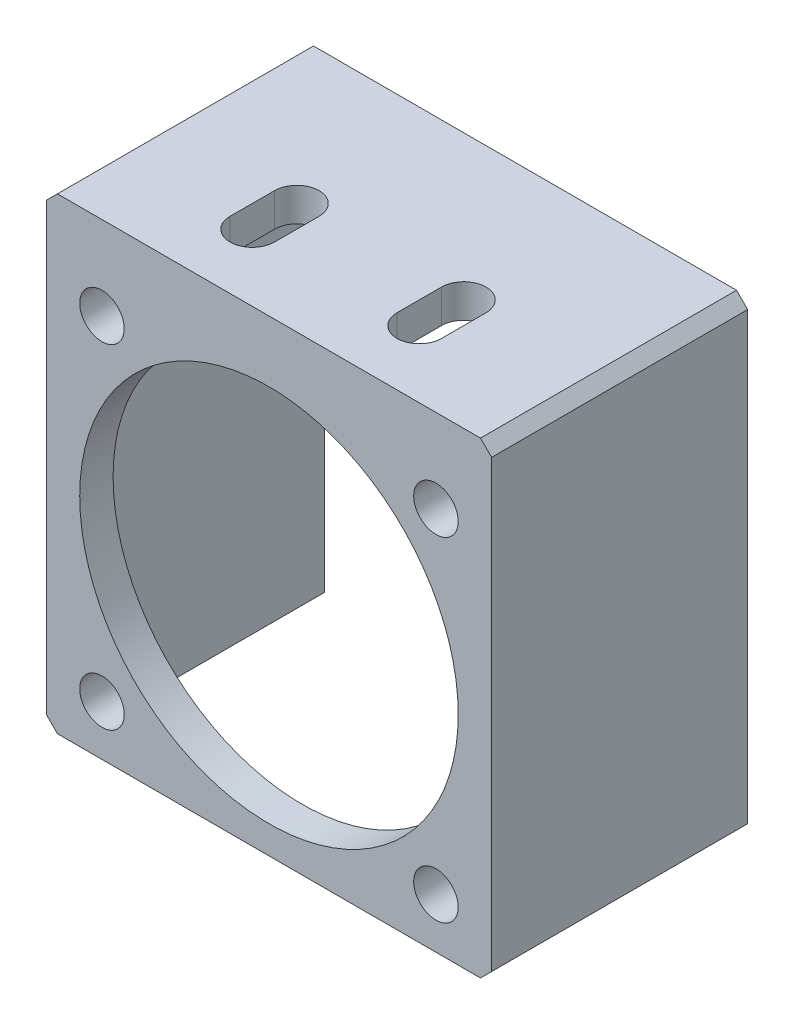
ISO-10303-21;
HEADER;
FILE_DESCRIPTION(('STEP AP214'),'2;1');
FILE_NAME('part.step','',(''),(''),'','','');
FILE_SCHEMA(('AUTOMOTIVE_DESIGN { 1 0 10303 214 1 1 1 1 }'));
ENDSEC;
DATA;
#1=APPLICATION_CONTEXT('core data for automotive mechanical design processes');
#2=APPLICATION_PROTOCOL_DEFINITION('international standard','automotive_design',2000,#1);
#3=PRODUCT_CONTEXT('',#1,'mechanical');
#4=PRODUCT('Part','Part','',(#3));
#5=PRODUCT_RELATED_PRODUCT_CATEGORY('part','',(#4));
#6=PRODUCT_DEFINITION_FORMATION('','',#4);
#7=PRODUCT_DEFINITION_CONTEXT('part definition',#1,'design');
#8=PRODUCT_DEFINITION('design','',#6,#7);
#9=PRODUCT_DEFINITION_SHAPE('','',#8);
#10=(LENGTH_UNIT() NAMED_UNIT(*) SI_UNIT(.MILLI.,.METRE.));
#11=(NAMED_UNIT(*) PLANE_ANGLE_UNIT() SI_UNIT($,.RADIAN.));
#12=(NAMED_UNIT(*) SI_UNIT($,.STERADIAN.) SOLID_ANGLE_UNIT());
#13=UNCERTAINTY_MEASURE_WITH_UNIT(LENGTH_MEASURE(1.E-05),#10,'distance_accuracy_value','');
#14=(GEOMETRIC_REPRESENTATION_CONTEXT(3) GLOBAL_UNCERTAINTY_ASSIGNED_CONTEXT((#13)) GLOBAL_UNIT_ASSIGNED_CONTEXT((#10,
#11,#12)) REPRESENTATION_CONTEXT('',''));
#15=CARTESIAN_POINT('',(0.,0.,0.));
#16=DIRECTION('',(0.,0.,1.));
#17=DIRECTION('',(1.,0.,0.));
#18=AXIS2_PLACEMENT_3D('',#15,#16,#17);
#19=CARTESIAN_POINT('',(-6.20338927881193,0.,3.));
#20=DIRECTION('',(1.,0.,0.));
#21=DIRECTION('',(0.,1.,0.));
#22=AXIS2_PLACEMENT_3D('',#19,#20,#21);
#23=PLANE('',#22);
#24=DIRECTION('',(0.,-1.,0.));
#25=VECTOR('',#24,1.);
#26=CARTESIAN_POINT('',(-6.20338927881193,42.3009142443808,-20.));
#27=LINE('',#26,#25);
#28=CARTESIAN_POINT('',(-6.20338927881193,41.3009142443808,-20.));
#29=VERTEX_POINT('',#28);
#30=CARTESIAN_POINT('',(-6.20338927881193,1.30091424438084,-20.));
#31=VERTEX_POINT('',#30);
#32=EDGE_CURVE('E277',#29,#31,#27,.T.);
#33=ORIENTED_EDGE('',*,*,#32,.F.);
#34=DIRECTION('',(0.,0.,1.));
#35=VECTOR('',#34,1.);
#36=CARTESIAN_POINT('',(-6.20338927881193,41.3009142443808,-22.));
#37=LINE('',#36,#35);
#38=CARTESIAN_POINT('',(-6.20338927881193,41.3009142443808,3.));
#39=VERTEX_POINT('',#38);
#40=EDGE_CURVE('E250',#29,#39,#37,.T.);
#41=ORIENTED_EDGE('',*,*,#40,.T.);
#42=DIRECTION('',(0.,-1.,0.));
#43=VECTOR('',#42,1.);
#44=CARTESIAN_POINT('',(-6.20338927881193,0.,3.));
#45=LINE('',#44,#43);
#46=CARTESIAN_POINT('',(-6.20338927881193,1.30091424438084,3.));
#47=VERTEX_POINT('',#46);
#48=EDGE_CURVE('E320',#39,#47,#45,.T.);
#49=ORIENTED_EDGE('',*,*,#48,.T.);
#50=DIRECTION('',(0.,0.,1.));
#51=VECTOR('',#50,1.);
#52=CARTESIAN_POINT('',(-6.20338927881193,1.30091424438084,-22.));
#53=LINE('',#52,#51);
#54=EDGE_CURVE('E257',#31,#47,#53,.T.);
#55=ORIENTED_EDGE('',*,*,#54,.F.);
#56=EDGE_LOOP('',(#33,#41,#49,#55));
#57=FACE_BOUND('',#56,.T.);
#58=ADVANCED_FACE('F43',(#57),#23,.T.);
#59=CARTESIAN_POINT('',(0.,42.3009142443808,3.));
#60=DIRECTION('',(0.,1.,0.));
#61=DIRECTION('',(0.,0.,1.));
#62=AXIS2_PLACEMENT_3D('',#59,#60,#61);
#63=PLANE('',#62);
#64=CARTESIAN_POINT('',(-18.7033892788119,42.3009142443808,-3.));
#65=DIRECTION('',(0.,1.,0.));
#66=DIRECTION('',(0.,0.,1.));
#67=AXIS2_PLACEMENT_3D('',#64,#65,#66);
#68=CIRCLE('',#67,2.);
#69=CARTESIAN_POINT('',(-20.7033892788119,42.3009142443808,-3.));
#70=VERTEX_POINT('',#69);
#71=CARTESIAN_POINT('',(-16.7033892788119,42.3009142443808,-3.));
#72=VERTEX_POINT('',#71);
#73=EDGE_CURVE('E58',#70,#72,#68,.T.);
#74=ORIENTED_EDGE('',*,*,#73,.F.);
#75=DIRECTION('',(0.,0.,1.));
#76=VECTOR('',#75,1.);
#77=CARTESIAN_POINT('',(-20.7033892788119,42.3009142443808,-7.));
#78=LINE('',#77,#76);
#79=CARTESIAN_POINT('',(-20.7033892788119,42.3009142443808,-7.));
#80=VERTEX_POINT('',#79);
#81=EDGE_CURVE('E204',#80,#70,#78,.T.);
#82=ORIENTED_EDGE('',*,*,#81,.F.);
#83=CARTESIAN_POINT('',(-18.7033892788119,42.3009142443808,-7.));
#84=DIRECTION('',(0.,1.,0.));
#85=DIRECTION('',(0.,0.,1.));
#86=AXIS2_PLACEMENT_3D('',#83,#84,#85);
#87=CIRCLE('',#86,2.);
#88=CARTESIAN_POINT('',(-16.7033892788119,42.3009142443808,-7.));
#89=VERTEX_POINT('',#88);
#90=EDGE_CURVE('E187',#89,#80,#87,.T.);
#91=ORIENTED_EDGE('',*,*,#90,.F.);
#92=DIRECTION('',(0.,0.,-1.));
#93=VECTOR('',#92,1.);
#94=CARTESIAN_POINT('',(-16.7033892788119,42.3009142443808,-3.));
#95=LINE('',#94,#93);
#96=EDGE_CURVE('E197',#72,#89,#95,.T.);
#97=ORIENTED_EDGE('',*,*,#96,.F.);
#98=EDGE_LOOP('',(#74,#82,#91,#97));
#99=FACE_BOUND('',#98,.T.);
#100=CARTESIAN_POINT('',(-33.7033892788119,42.3009142443808,-7.));
#101=DIRECTION('',(0.,1.,0.));
#102=DIRECTION('',(0.,0.,1.));
#103=AXIS2_PLACEMENT_3D('',#100,#101,#102);
#104=CIRCLE('',#103,2.);
#105=CARTESIAN_POINT('',(-31.7033892788119,42.3009142443808,-7.));
#106=VERTEX_POINT('',#105);
#107=CARTESIAN_POINT('',(-35.7033892788119,42.3009142443808,-7.));
#108=VERTEX_POINT('',#107);
#109=EDGE_CURVE('E66',#106,#108,#104,.T.);
#110=ORIENTED_EDGE('',*,*,#109,.F.);
#111=DIRECTION('',(0.,0.,-1.));
#112=VECTOR('',#111,1.);
#113=CARTESIAN_POINT('',(-31.7033892788119,42.3009142443808,-3.));
#114=LINE('',#113,#112);
#115=CARTESIAN_POINT('',(-31.7033892788119,42.3009142443808,-3.));
#116=VERTEX_POINT('',#115);
#117=EDGE_CURVE('E216',#116,#106,#114,.T.);
#118=ORIENTED_EDGE('',*,*,#117,.F.);
#119=CARTESIAN_POINT('',(-33.7033892788119,42.3009142443808,-3.));
#120=DIRECTION('',(0.,1.,0.));
#121=DIRECTION('',(0.,0.,1.));
#122=AXIS2_PLACEMENT_3D('',#119,#120,#121);
#123=CIRCLE('',#122,2.);
#124=CARTESIAN_POINT('',(-35.7033892788119,42.3009142443808,-3.));
#125=VERTEX_POINT('',#124);
#126=EDGE_CURVE('E225',#125,#116,#123,.T.);
#127=ORIENTED_EDGE('',*,*,#126,.F.);
#128=DIRECTION('',(0.,0.,1.));
#129=VECTOR('',#128,1.);
#130=CARTESIAN_POINT('',(-35.7033892788119,42.3009142443808,-7.));
#131=LINE('',#130,#129);
#132=EDGE_CURVE('E228',#108,#125,#131,.T.);
#133=ORIENTED_EDGE('',*,*,#132,.F.);
#134=EDGE_LOOP('',(#110,#118,#127,#133));
#135=FACE_BOUND('',#134,.T.);
#136=DIRECTION('',(1.,0.,0.));
#137=VECTOR('',#136,1.);
#138=CARTESIAN_POINT('',(0.,42.3009142443808,3.));
#139=LINE('',#138,#137);
#140=CARTESIAN_POINT('',(-45.2033892788119,42.3009142443808,3.));
#141=VERTEX_POINT('',#140);
#142=CARTESIAN_POINT('',(-7.20338927881193,42.3009142443808,3.));
#143=VERTEX_POINT('',#142);
#144=EDGE_CURVE('E323',#141,#143,#139,.T.);
#145=ORIENTED_EDGE('',*,*,#144,.T.);
#146=DIRECTION('',(0.,0.,1.));
#147=VECTOR('',#146,1.);
#148=CARTESIAN_POINT('',(-7.20338927881193,42.3009142443808,-22.));
#149=LINE('',#148,#147);
#150=CARTESIAN_POINT('',(-7.20338927881193,42.3009142443808,-20.));
#151=VERTEX_POINT('',#150);
#152=EDGE_CURVE('E244',#151,#143,#149,.T.);
#153=ORIENTED_EDGE('',*,*,#152,.F.);
#154=DIRECTION('',(1.,0.,0.));
#155=VECTOR('',#154,1.);
#156=CARTESIAN_POINT('',(-6.20338927881193,42.3009142443808,-20.));
#157=LINE('',#156,#155);
#158=CARTESIAN_POINT('',(-45.2033892788119,42.3009142443808,-20.));
#159=VERTEX_POINT('',#158);
#160=EDGE_CURVE('E274',#159,#151,#157,.T.);
#161=ORIENTED_EDGE('',*,*,#160,.F.);
#162=DIRECTION('',(0.,0.,1.));
#163=VECTOR('',#162,1.);
#164=CARTESIAN_POINT('',(-45.2033892788119,42.3009142443808,-22.));
#165=LINE('',#164,#163);
#166=EDGE_CURVE('E235',#159,#141,#165,.T.);
#167=ORIENTED_EDGE('',*,*,#166,.T.);
#168=EDGE_LOOP('',(#145,#153,#161,#167));
#169=FACE_BOUND('',#168,.T.);
#170=ADVANCED_FACE('F201',(#99,#135,#169),#63,.T.);
#171=CARTESIAN_POINT('',(0.,0.30091424438084,3.));
#172=DIRECTION('',(0.,1.,0.));
#173=DIRECTION('',(0.,0.,1.));
#174=AXIS2_PLACEMENT_3D('',#171,#172,#173);
#175=PLANE('',#174);
#176=DIRECTION('',(1.,0.,0.));
#177=VECTOR('',#176,1.);
#178=CARTESIAN_POINT('',(0.,0.30091424438084,3.));
#179=LINE('',#178,#177);
#180=CARTESIAN_POINT('',(-45.2033892788119,0.300914244380837,3.));
#181=VERTEX_POINT('',#180);
#182=CARTESIAN_POINT('',(-7.20338927881193,0.30091424438084,3.));
#183=VERTEX_POINT('',#182);
#184=EDGE_CURVE('E329',#181,#183,#179,.T.);
#185=ORIENTED_EDGE('',*,*,#184,.F.);
#186=DIRECTION('',(0.,0.,1.));
#187=VECTOR('',#186,1.);
#188=CARTESIAN_POINT('',(-45.2033892788119,0.300914244380837,-22.));
#189=LINE('',#188,#187);
#190=CARTESIAN_POINT('',(-45.2033892788119,0.300914244380837,-20.));
#191=VERTEX_POINT('',#190);
#192=EDGE_CURVE('E234',#191,#181,#189,.T.);
#193=ORIENTED_EDGE('',*,*,#192,.F.);
#194=DIRECTION('',(-1.,0.,0.));
#195=VECTOR('',#194,1.);
#196=CARTESIAN_POINT('',(-46.2033892788119,0.30091424438084,-20.));
#197=LINE('',#196,#195);
#198=CARTESIAN_POINT('',(-44.2033892788119,0.300914244380838,-20.));
#199=VERTEX_POINT('',#198);
#200=EDGE_CURVE('E268',#199,#191,#197,.T.);
#201=ORIENTED_EDGE('',*,*,#200,.F.);
#202=DIRECTION('',(0.,0.,1.));
#203=VECTOR('',#202,1.);
#204=CARTESIAN_POINT('',(-44.2033892788119,0.300914244380838,-20.));
#205=LINE('',#204,#203);
#206=CARTESIAN_POINT('',(-44.2033892788119,0.300914244380838,0.));
#207=VERTEX_POINT('',#206);
#208=EDGE_CURVE('E297',#199,#207,#205,.T.);
#209=ORIENTED_EDGE('',*,*,#208,.T.);
#210=DIRECTION('',(1.,0.,0.));
#211=VECTOR('',#210,1.);
#212=CARTESIAN_POINT('',(0.,0.30091424438084,0.));
#213=LINE('',#212,#211);
#214=CARTESIAN_POINT('',(-8.20338927881192,0.30091424438084,0.));
#215=VERTEX_POINT('',#214);
#216=EDGE_CURVE('E308',#207,#215,#213,.T.);
#217=ORIENTED_EDGE('',*,*,#216,.T.);
#218=DIRECTION('',(0.,0.,1.));
#219=VECTOR('',#218,1.);
#220=CARTESIAN_POINT('',(-8.20338927881192,0.30091424438084,-20.));
#221=LINE('',#220,#219);
#222=CARTESIAN_POINT('',(-8.20338927881192,0.30091424438084,-20.));
#223=VERTEX_POINT('',#222);
#224=EDGE_CURVE('E294',#223,#215,#221,.T.);
#225=ORIENTED_EDGE('',*,*,#224,.F.);
#226=DIRECTION('',(-1.,0.,0.));
#227=VECTOR('',#226,1.);
#228=CARTESIAN_POINT('',(-8.20338927881192,0.30091424438084,-20.));
#229=LINE('',#228,#227);
#230=CARTESIAN_POINT('',(-7.20338927881193,0.30091424438084,-20.));
#231=VERTEX_POINT('',#230);
#232=EDGE_CURVE('E280',#231,#223,#229,.T.);
#233=ORIENTED_EDGE('',*,*,#232,.F.);
#234=DIRECTION('',(0.,0.,1.));
#235=VECTOR('',#234,1.);
#236=CARTESIAN_POINT('',(-7.20338927881193,0.30091424438084,-22.));
#237=LINE('',#236,#235);
#238=EDGE_CURVE('E256',#231,#183,#237,.T.);
#239=ORIENTED_EDGE('',*,*,#238,.T.);
#240=EDGE_LOOP('',(#185,#193,#201,#209,#217,#225,#233,#239));
#241=FACE_BOUND('',#240,.T.);
#242=ADVANCED_FACE('F401',(#241),#175,.F.);
#243=CARTESIAN_POINT('',(0.,0.,3.));
#244=DIRECTION('',(0.,0.,1.));
#245=DIRECTION('',(1.,0.,0.));
#246=AXIS2_PLACEMENT_3D('',#243,#244,#245);
#247=PLANE('',#246);
#248=CARTESIAN_POINT('',(-26.2033892788119,19.8009142443808,3.));
#249=DIRECTION('',(0.,0.,1.));
#250=DIRECTION('',(1.,0.,0.));
#251=AXIS2_PLACEMENT_3D('',#248,#249,#250);
#252=CIRCLE('',#251,17.);
#253=CARTESIAN_POINT('',(-9.20338927881193,19.8009142443808,3.));
#254=VERTEX_POINT('',#253);
#255=EDGE_CURVE('E304',#254,#254,#252,.T.);
#256=ORIENTED_EDGE('',*,*,#255,.F.);
#257=EDGE_LOOP('',(#256));
#258=FACE_BOUND('',#257,.T.);
#259=CARTESIAN_POINT('',(-11.2033892788119,4.80091424438084,3.));
#260=DIRECTION('',(0.,0.,1.));
#261=DIRECTION('',(1.,0.,0.));
#262=AXIS2_PLACEMENT_3D('',#259,#260,#261);
#263=CIRCLE('',#262,2.);
#264=CARTESIAN_POINT('',(-9.20338927881193,4.80091424438084,3.));
#265=VERTEX_POINT('',#264);
#266=EDGE_CURVE('E307',#265,#265,#263,.T.);
#267=ORIENTED_EDGE('',*,*,#266,.F.);
#268=EDGE_LOOP('',(#267));
#269=FACE_BOUND('',#268,.T.);
#270=CARTESIAN_POINT('',(-41.2033892788119,4.80091424438084,3.));
#271=DIRECTION('',(0.,0.,1.));
#272=DIRECTION('',(1.,0.,0.));
#273=AXIS2_PLACEMENT_3D('',#270,#271,#272);
#274=CIRCLE('',#273,2.);
#275=CARTESIAN_POINT('',(-39.2033892788119,4.80091424438084,3.));
#276=VERTEX_POINT('',#275);
#277=EDGE_CURVE('E311',#276,#276,#274,.T.);
#278=ORIENTED_EDGE('',*,*,#277,.F.);
#279=EDGE_LOOP('',(#278));
#280=FACE_BOUND('',#279,.T.);
#281=CARTESIAN_POINT('',(-11.2033892788119,34.8009142443808,3.));
#282=DIRECTION('',(0.,0.,1.));
#283=DIRECTION('',(1.,0.,0.));
#284=AXIS2_PLACEMENT_3D('',#281,#282,#283);
#285=CIRCLE('',#284,2.);
#286=CARTESIAN_POINT('',(-9.20338927881193,34.8009142443808,3.));
#287=VERTEX_POINT('',#286);
#288=EDGE_CURVE('E314',#287,#287,#285,.T.);
#289=ORIENTED_EDGE('',*,*,#288,.F.);
#290=EDGE_LOOP('',(#289));
#291=FACE_BOUND('',#290,.T.);
#292=CARTESIAN_POINT('',(-41.2033892788119,34.8009142443808,3.));
#293=DIRECTION('',(0.,0.,1.));
#294=DIRECTION('',(1.,0.,0.));
#295=AXIS2_PLACEMENT_3D('',#292,#293,#294);
#296=CIRCLE('',#295,2.);
#297=CARTESIAN_POINT('',(-39.2033892788119,34.8009142443808,3.));
#298=VERTEX_POINT('',#297);
#299=EDGE_CURVE('E317',#298,#298,#296,.T.);
#300=ORIENTED_EDGE('',*,*,#299,.F.);
#301=EDGE_LOOP('',(#300));
#302=FACE_BOUND('',#301,.T.);
#303=ORIENTED_EDGE('',*,*,#48,.F.);
#304=DIRECTION('',(-0.707106781186547,0.707106781186548,0.));
#305=VECTOR('',#304,1.);
#306=CARTESIAN_POINT('',(17.5487624827845,17.5487624827844,3.));
#307=LINE('',#306,#305);
#308=EDGE_CURVE('E211',#39,#143,#307,.T.);
#309=ORIENTED_EDGE('',*,*,#308,.T.);
#310=ORIENTED_EDGE('',*,*,#144,.F.);
#311=DIRECTION('',(0.707106781186548,0.707106781186548,0.));
#312=VECTOR('',#311,1.);
#313=CARTESIAN_POINT('',(-43.7521517615964,43.7521517615964,3.));
#314=LINE('',#313,#312);
#315=CARTESIAN_POINT('',(-46.2033892788119,41.3009142443808,3.));
#316=VERTEX_POINT('',#315);
#317=EDGE_CURVE('E241',#316,#141,#314,.T.);
#318=ORIENTED_EDGE('',*,*,#317,.F.);
#319=DIRECTION('',(0.,-1.,0.));
#320=VECTOR('',#319,1.);
#321=CARTESIAN_POINT('',(-46.2033892788119,0.,3.));
#322=LINE('',#321,#320);
#323=CARTESIAN_POINT('',(-46.2033892788119,1.30091424438084,3.));
#324=VERTEX_POINT('',#323);
#325=EDGE_CURVE('E326',#316,#324,#322,.T.);
#326=ORIENTED_EDGE('',*,*,#325,.T.);
#327=DIRECTION('',(-0.707106781186548,0.707106781186547,0.));
#328=VECTOR('',#327,1.);
#329=CARTESIAN_POINT('',(-22.4512375172155,-22.4512375172155,3.));
#330=LINE('',#329,#328);
#331=EDGE_CURVE('E232',#181,#324,#330,.T.);
#332=ORIENTED_EDGE('',*,*,#331,.F.);
#333=ORIENTED_EDGE('',*,*,#184,.T.);
#334=DIRECTION('',(0.707106781186546,0.707106781186549,0.));
#335=VECTOR('',#334,1.);
#336=CARTESIAN_POINT('',(-3.7521517615964,3.75215176159638,3.));
#337=LINE('',#336,#335);
#338=EDGE_CURVE('E239',#183,#47,#337,.T.);
#339=ORIENTED_EDGE('',*,*,#338,.T.);
#340=EDGE_LOOP('',(#303,#309,#310,#318,#326,#332,#333,#339));
#341=FACE_BOUND('',#340,.T.);
#342=ADVANCED_FACE('F455',(#258,#269,#280,#291,#302,#341),#247,.T.);
#343=CARTESIAN_POINT('',(0.,0.,-20.));
#344=DIRECTION('',(0.,0.,-1.));
#345=DIRECTION('',(-1.,0.,0.));
#346=AXIS2_PLACEMENT_3D('',#343,#344,#345);
#347=PLANE('',#346);
#348=ORIENTED_EDGE('',*,*,#160,.T.);
#349=DIRECTION('',(0.707106781186547,-0.707106781186548,0.));
#350=VECTOR('',#349,1.);
#351=CARTESIAN_POINT('',(17.5487624827845,17.5487624827844,-20.));
#352=LINE('',#351,#350);
#353=EDGE_CURVE('E355',#151,#29,#352,.T.);
#354=ORIENTED_EDGE('',*,*,#353,.T.);
#355=ORIENTED_EDGE('',*,*,#32,.T.);
#356=DIRECTION('',(-0.707106781186546,-0.707106781186549,0.));
#357=VECTOR('',#356,1.);
#358=CARTESIAN_POINT('',(-3.7521517615964,3.75215176159638,-20.));
#359=LINE('',#358,#357);
#360=EDGE_CURVE('E332',#31,#231,#359,.T.);
#361=ORIENTED_EDGE('',*,*,#360,.T.);
#362=ORIENTED_EDGE('',*,*,#232,.T.);
#363=DIRECTION('',(0.,1.,0.));
#364=VECTOR('',#363,1.);
#365=CARTESIAN_POINT('',(-8.20338927881192,39.3009142443808,-20.));
#366=LINE('',#365,#364);
#367=CARTESIAN_POINT('',(-8.20338927881192,39.3009142443808,-20.));
#368=VERTEX_POINT('',#367);
#369=EDGE_CURVE('E282',#223,#368,#366,.T.);
#370=ORIENTED_EDGE('',*,*,#369,.T.);
#371=DIRECTION('',(-1.,0.,0.));
#372=VECTOR('',#371,1.);
#373=CARTESIAN_POINT('',(-44.2033892788119,39.3009142443808,-20.));
#374=LINE('',#373,#372);
#375=CARTESIAN_POINT('',(-44.2033892788119,39.3009142443808,-20.));
#376=VERTEX_POINT('',#375);
#377=EDGE_CURVE('E262',#368,#376,#374,.T.);
#378=ORIENTED_EDGE('',*,*,#377,.T.);
#379=DIRECTION('',(0.,-1.,0.));
#380=VECTOR('',#379,1.);
#381=CARTESIAN_POINT('',(-44.2033892788119,0.300914244380838,-20.));
#382=LINE('',#381,#380);
#383=EDGE_CURVE('E265',#376,#199,#382,.T.);
#384=ORIENTED_EDGE('',*,*,#383,.T.);
#385=ORIENTED_EDGE('',*,*,#200,.T.);
#386=DIRECTION('',(0.707106781186548,-0.707106781186547,0.));
#387=VECTOR('',#386,1.);
#388=CARTESIAN_POINT('',(-22.4512375172155,-22.4512375172155,-20.));
#389=LINE('',#388,#387);
#390=CARTESIAN_POINT('',(-46.2033892788119,1.30091424438084,-20.));
#391=VERTEX_POINT('',#390);
#392=EDGE_CURVE('E351',#391,#191,#389,.T.);
#393=ORIENTED_EDGE('',*,*,#392,.F.);
#394=DIRECTION('',(0.,1.,0.));
#395=VECTOR('',#394,1.);
#396=CARTESIAN_POINT('',(-46.2033892788119,42.3009142443808,-20.));
#397=LINE('',#396,#395);
#398=CARTESIAN_POINT('',(-46.2033892788119,41.3009142443808,-20.));
#399=VERTEX_POINT('',#398);
#400=EDGE_CURVE('E271',#391,#399,#397,.T.);
#401=ORIENTED_EDGE('',*,*,#400,.T.);
#402=DIRECTION('',(-0.707106781186548,-0.707106781186548,0.));
#403=VECTOR('',#402,1.);
#404=CARTESIAN_POINT('',(-43.7521517615964,43.7521517615964,-20.));
#405=LINE('',#404,#403);
#406=EDGE_CURVE('E353',#159,#399,#405,.T.);
#407=ORIENTED_EDGE('',*,*,#406,.F.);
#408=EDGE_LOOP('',(#348,#354,#355,#361,#362,#370,#378,#384,#385,#393,#401,#407));
#409=FACE_BOUND('',#408,.T.);
#410=ADVANCED_FACE('F432',(#409),#347,.T.);
#411=CARTESIAN_POINT('',(0.,0.,0.));
#412=DIRECTION('',(0.,0.,1.));
#413=DIRECTION('',(1.,0.,0.));
#414=AXIS2_PLACEMENT_3D('',#411,#412,#413);
#415=PLANE('',#414);
#416=CARTESIAN_POINT('',(-41.2033892788119,34.8009142443808,0.));
#417=DIRECTION('',(0.,0.,1.));
#418=DIRECTION('',(1.,0.,0.));
#419=AXIS2_PLACEMENT_3D('',#416,#417,#418);
#420=CIRCLE('',#419,2.);
#421=CARTESIAN_POINT('',(-39.2033892788119,34.8009142443808,0.));
#422=VERTEX_POINT('',#421);
#423=EDGE_CURVE('E344',#422,#422,#420,.T.);
#424=ORIENTED_EDGE('',*,*,#423,.T.);
#425=EDGE_LOOP('',(#424));
#426=FACE_BOUND('',#425,.T.);
#427=CARTESIAN_POINT('',(-11.2033892788119,34.8009142443808,0.));
#428=DIRECTION('',(0.,0.,1.));
#429=DIRECTION('',(1.,0.,0.));
#430=AXIS2_PLACEMENT_3D('',#427,#428,#429);
#431=CIRCLE('',#430,2.);
#432=CARTESIAN_POINT('',(-9.20338927881193,34.8009142443808,0.));
#433=VERTEX_POINT('',#432);
#434=EDGE_CURVE('E341',#433,#433,#431,.T.);
#435=ORIENTED_EDGE('',*,*,#434,.T.);
#436=EDGE_LOOP('',(#435));
#437=FACE_BOUND('',#436,.T.);
#438=CARTESIAN_POINT('',(-41.2033892788119,4.80091424438084,0.));
#439=DIRECTION('',(0.,0.,1.));
#440=DIRECTION('',(1.,0.,0.));
#441=AXIS2_PLACEMENT_3D('',#438,#439,#440);
#442=CIRCLE('',#441,2.);
#443=CARTESIAN_POINT('',(-39.2033892788119,4.80091424438084,0.));
#444=VERTEX_POINT('',#443);
#445=EDGE_CURVE('E338',#444,#444,#442,.T.);
#446=ORIENTED_EDGE('',*,*,#445,.T.);
#447=EDGE_LOOP('',(#446));
#448=FACE_BOUND('',#447,.T.);
#449=CARTESIAN_POINT('',(-11.2033892788119,4.80091424438084,0.));
#450=DIRECTION('',(0.,0.,1.));
#451=DIRECTION('',(1.,0.,0.));
#452=AXIS2_PLACEMENT_3D('',#449,#450,#451);
#453=CIRCLE('',#452,2.);
#454=CARTESIAN_POINT('',(-9.20338927881193,4.80091424438084,0.));
#455=VERTEX_POINT('',#454);
#456=EDGE_CURVE('E335',#455,#455,#453,.T.);
#457=ORIENTED_EDGE('',*,*,#456,.T.);
#458=EDGE_LOOP('',(#457));
#459=FACE_BOUND('',#458,.T.);
#460=CARTESIAN_POINT('',(-26.2033892788119,19.8009142443808,0.));
#461=DIRECTION('',(0.,0.,1.));
#462=DIRECTION('',(1.,0.,0.));
#463=AXIS2_PLACEMENT_3D('',#460,#461,#462);
#464=CIRCLE('',#463,17.);
#465=CARTESIAN_POINT('',(-9.20338927881193,19.8009142443808,0.));
#466=VERTEX_POINT('',#465);
#467=EDGE_CURVE('E303',#466,#466,#464,.T.);
#468=ORIENTED_EDGE('',*,*,#467,.T.);
#469=EDGE_LOOP('',(#468));
#470=FACE_BOUND('',#469,.T.);
#471=DIRECTION('',(0.,1.,0.));
#472=VECTOR('',#471,1.);
#473=CARTESIAN_POINT('',(-8.20338927881192,39.3009142443808,0.));
#474=LINE('',#473,#472);
#475=CARTESIAN_POINT('',(-8.20338927881192,39.3009142443808,0.));
#476=VERTEX_POINT('',#475);
#477=EDGE_CURVE('E266',#215,#476,#474,.T.);
#478=ORIENTED_EDGE('',*,*,#477,.F.);
#479=ORIENTED_EDGE('',*,*,#216,.F.);
#480=DIRECTION('',(0.,-1.,0.));
#481=VECTOR('',#480,1.);
#482=CARTESIAN_POINT('',(-44.2033892788119,0.300914244380838,0.));
#483=LINE('',#482,#481);
#484=CARTESIAN_POINT('',(-44.2033892788119,39.3009142443808,0.));
#485=VERTEX_POINT('',#484);
#486=EDGE_CURVE('E287',#485,#207,#483,.T.);
#487=ORIENTED_EDGE('',*,*,#486,.F.);
#488=DIRECTION('',(-1.,0.,0.));
#489=VECTOR('',#488,1.);
#490=CARTESIAN_POINT('',(-44.2033892788119,39.3009142443808,0.));
#491=LINE('',#490,#489);
#492=EDGE_CURVE('E259',#476,#485,#491,.T.);
#493=ORIENTED_EDGE('',*,*,#492,.F.);
#494=EDGE_LOOP('',(#478,#479,#487,#493));
#495=FACE_BOUND('',#494,.T.);
#496=ADVANCED_FACE('F429',(#426,#437,#448,#459,#470,#495),#415,.F.);
#497=CARTESIAN_POINT('',(-46.2033892788119,0.,3.));
#498=DIRECTION('',(1.,0.,0.));
#499=DIRECTION('',(0.,0.,-1.));
#500=AXIS2_PLACEMENT_3D('',#497,#498,#499);
#501=PLANE('',#500);
#502=ORIENTED_EDGE('',*,*,#325,.F.);
#503=DIRECTION('',(0.,0.,1.));
#504=VECTOR('',#503,1.);
#505=CARTESIAN_POINT('',(-46.2033892788119,41.3009142443808,-22.));
#506=LINE('',#505,#504);
#507=EDGE_CURVE('E243',#399,#316,#506,.T.);
#508=ORIENTED_EDGE('',*,*,#507,.F.);
#509=ORIENTED_EDGE('',*,*,#400,.F.);
#510=DIRECTION('',(0.,0.,1.));
#511=VECTOR('',#510,1.);
#512=CARTESIAN_POINT('',(-46.2033892788119,1.30091424438084,-22.));
#513=LINE('',#512,#511);
#514=EDGE_CURVE('E236',#391,#324,#513,.T.);
#515=ORIENTED_EDGE('',*,*,#514,.T.);
#516=EDGE_LOOP('',(#502,#508,#509,#515));
#517=FACE_BOUND('',#516,.T.);
#518=ADVANCED_FACE('F410',(#517),#501,.F.);
#519=CARTESIAN_POINT('',(-41.2033892788119,34.8009142443808,3.));
#520=DIRECTION('',(0.,0.,-1.));
#521=DIRECTION('',(-1.,0.,0.));
#522=AXIS2_PLACEMENT_3D('',#519,#520,#521);
#523=CYLINDRICAL_SURFACE('',#522,2.);
#524=ORIENTED_EDGE('',*,*,#299,.T.);
#525=EDGE_LOOP('',(#524));
#526=FACE_BOUND('',#525,.T.);
#527=ORIENTED_EDGE('',*,*,#423,.F.);
#528=EDGE_LOOP('',(#527));
#529=FACE_BOUND('',#528,.T.);
#530=ADVANCED_FACE('F406',(#526,#529),#523,.F.);
#531=CARTESIAN_POINT('',(-11.2033892788119,34.8009142443808,3.));
#532=DIRECTION('',(0.,0.,-1.));
#533=DIRECTION('',(-1.,0.,0.));
#534=AXIS2_PLACEMENT_3D('',#531,#532,#533);
#535=CYLINDRICAL_SURFACE('',#534,2.);
#536=ORIENTED_EDGE('',*,*,#288,.T.);
#537=EDGE_LOOP('',(#536));
#538=FACE_BOUND('',#537,.T.);
#539=ORIENTED_EDGE('',*,*,#434,.F.);
#540=EDGE_LOOP('',(#539));
#541=FACE_BOUND('',#540,.T.);
#542=ADVANCED_FACE('F409',(#538,#541),#535,.F.);
#543=CARTESIAN_POINT('',(-41.2033892788119,4.80091424438084,3.));
#544=DIRECTION('',(0.,0.,-1.));
#545=DIRECTION('',(-1.,0.,0.));
#546=AXIS2_PLACEMENT_3D('',#543,#544,#545);
#547=CYLINDRICAL_SURFACE('',#546,2.);
#548=ORIENTED_EDGE('',*,*,#277,.T.);
#549=EDGE_LOOP('',(#548));
#550=FACE_BOUND('',#549,.T.);
#551=ORIENTED_EDGE('',*,*,#445,.F.);
#552=EDGE_LOOP('',(#551));
#553=FACE_BOUND('',#552,.T.);
#554=ADVANCED_FACE('F414',(#550,#553),#547,.F.);
#555=CARTESIAN_POINT('',(-11.2033892788119,4.80091424438084,3.));
#556=DIRECTION('',(0.,0.,-1.));
#557=DIRECTION('',(-1.,0.,0.));
#558=AXIS2_PLACEMENT_3D('',#555,#556,#557);
#559=CYLINDRICAL_SURFACE('',#558,2.);
#560=ORIENTED_EDGE('',*,*,#266,.T.);
#561=EDGE_LOOP('',(#560));
#562=FACE_BOUND('',#561,.T.);
#563=ORIENTED_EDGE('',*,*,#456,.F.);
#564=EDGE_LOOP('',(#563));
#565=FACE_BOUND('',#564,.T.);
#566=ADVANCED_FACE('F417',(#562,#565),#559,.F.);
#567=CARTESIAN_POINT('',(-26.2033892788119,19.8009142443808,3.));
#568=DIRECTION('',(0.,0.,-1.));
#569=DIRECTION('',(-1.,0.,0.));
#570=AXIS2_PLACEMENT_3D('',#567,#568,#569);
#571=CYLINDRICAL_SURFACE('',#570,17.);
#572=ORIENTED_EDGE('',*,*,#255,.T.);
#573=EDGE_LOOP('',(#572));
#574=FACE_BOUND('',#573,.T.);
#575=ORIENTED_EDGE('',*,*,#467,.F.);
#576=EDGE_LOOP('',(#575));
#577=FACE_BOUND('',#576,.T.);
#578=ADVANCED_FACE('F45',(#574,#577),#571,.F.);
#579=CARTESIAN_POINT('',(-44.2033892788119,39.3009142443808,-20.));
#580=DIRECTION('',(0.,1.,0.));
#581=DIRECTION('',(-1.,0.,0.));
#582=AXIS2_PLACEMENT_3D('',#579,#580,#581);
#583=PLANE('',#582);
#584=DIRECTION('',(0.,0.,1.));
#585=VECTOR('',#584,1.);
#586=CARTESIAN_POINT('',(-20.7033892788119,39.3009142443808,-20.));
#587=LINE('',#586,#585);
#588=CARTESIAN_POINT('',(-20.7033892788119,39.3009142443808,-7.));
#589=VERTEX_POINT('',#588);
#590=CARTESIAN_POINT('',(-20.7033892788119,39.3009142443808,-3.));
#591=VERTEX_POINT('',#590);
#592=EDGE_CURVE('E51',#589,#591,#587,.T.);
#593=ORIENTED_EDGE('',*,*,#592,.T.);
#594=CARTESIAN_POINT('',(-18.7033892788119,39.3009142443808,-3.));
#595=DIRECTION('',(0.,1.,0.));
#596=DIRECTION('',(-1.,0.,0.));
#597=AXIS2_PLACEMENT_3D('',#594,#595,#596);
#598=CIRCLE('',#597,2.);
#599=CARTESIAN_POINT('',(-16.7033892788119,39.3009142443808,-3.));
#600=VERTEX_POINT('',#599);
#601=EDGE_CURVE('E11',#591,#600,#598,.T.);
#602=ORIENTED_EDGE('',*,*,#601,.T.);
#603=DIRECTION('',(0.,0.,-1.));
#604=VECTOR('',#603,1.);
#605=CARTESIAN_POINT('',(-16.7033892788119,39.3009142443808,-20.));
#606=LINE('',#605,#604);
#607=CARTESIAN_POINT('',(-16.7033892788119,39.3009142443808,-7.));
#608=VERTEX_POINT('',#607);
#609=EDGE_CURVE('E370',#600,#608,#606,.T.);
#610=ORIENTED_EDGE('',*,*,#609,.T.);
#611=CARTESIAN_POINT('',(-18.7033892788119,39.3009142443808,-7.));
#612=DIRECTION('',(0.,1.,0.));
#613=DIRECTION('',(-1.,0.,0.));
#614=AXIS2_PLACEMENT_3D('',#611,#612,#613);
#615=CIRCLE('',#614,2.);
#616=EDGE_CURVE('E190',#608,#589,#615,.T.);
#617=ORIENTED_EDGE('',*,*,#616,.T.);
#618=EDGE_LOOP('',(#593,#602,#610,#617));
#619=FACE_BOUND('',#618,.T.);
#620=DIRECTION('',(0.,0.,-1.));
#621=VECTOR('',#620,1.);
#622=CARTESIAN_POINT('',(-31.7033892788119,39.3009142443808,-20.));
#623=LINE('',#622,#621);
#624=CARTESIAN_POINT('',(-31.7033892788119,39.3009142443808,-3.));
#625=VERTEX_POINT('',#624);
#626=CARTESIAN_POINT('',(-31.7033892788119,39.3009142443808,-7.));
#627=VERTEX_POINT('',#626);
#628=EDGE_CURVE('E364',#625,#627,#623,.T.);
#629=ORIENTED_EDGE('',*,*,#628,.T.);
#630=CARTESIAN_POINT('',(-33.7033892788119,39.3009142443808,-7.));
#631=DIRECTION('',(0.,1.,0.));
#632=DIRECTION('',(-1.,0.,0.));
#633=AXIS2_PLACEMENT_3D('',#630,#631,#632);
#634=CIRCLE('',#633,2.);
#635=CARTESIAN_POINT('',(-35.7033892788119,39.3009142443808,-7.));
#636=VERTEX_POINT('',#635);
#637=EDGE_CURVE('E367',#627,#636,#634,.T.);
#638=ORIENTED_EDGE('',*,*,#637,.T.);
#639=DIRECTION('',(0.,0.,1.));
#640=VECTOR('',#639,1.);
#641=CARTESIAN_POINT('',(-35.7033892788119,39.3009142443808,-20.));
#642=LINE('',#641,#640);
#643=CARTESIAN_POINT('',(-35.7033892788119,39.3009142443808,-3.));
#644=VERTEX_POINT('',#643);
#645=EDGE_CURVE('E358',#636,#644,#642,.T.);
#646=ORIENTED_EDGE('',*,*,#645,.T.);
#647=CARTESIAN_POINT('',(-33.7033892788119,39.3009142443808,-3.));
#648=DIRECTION('',(0.,1.,0.));
#649=DIRECTION('',(-1.,0.,0.));
#650=AXIS2_PLACEMENT_3D('',#647,#648,#649);
#651=CIRCLE('',#650,2.);
#652=EDGE_CURVE('E361',#644,#625,#651,.T.);
#653=ORIENTED_EDGE('',*,*,#652,.T.);
#654=EDGE_LOOP('',(#629,#638,#646,#653));
#655=FACE_BOUND('',#654,.T.);
#656=ORIENTED_EDGE('',*,*,#492,.T.);
#657=DIRECTION('',(0.,0.,1.));
#658=VECTOR('',#657,1.);
#659=CARTESIAN_POINT('',(-44.2033892788119,39.3009142443808,-20.));
#660=LINE('',#659,#658);
#661=EDGE_CURVE('E300',#376,#485,#660,.T.);
#662=ORIENTED_EDGE('',*,*,#661,.F.);
#663=ORIENTED_EDGE('',*,*,#377,.F.);
#664=DIRECTION('',(0.,0.,1.));
#665=VECTOR('',#664,1.);
#666=CARTESIAN_POINT('',(-8.20338927881192,39.3009142443808,-20.));
#667=LINE('',#666,#665);
#668=EDGE_CURVE('E284',#368,#476,#667,.T.);
#669=ORIENTED_EDGE('',*,*,#668,.T.);
#670=EDGE_LOOP('',(#656,#662,#663,#669));
#671=FACE_BOUND('',#670,.T.);
#672=ADVANCED_FACE('F374',(#619,#655,#671),#583,.F.);
#673=CARTESIAN_POINT('',(-44.2033892788119,0.300914244380838,-20.));
#674=DIRECTION('',(-1.,0.,0.));
#675=DIRECTION('',(0.,0.,1.));
#676=AXIS2_PLACEMENT_3D('',#673,#674,#675);
#677=PLANE('',#676);
#678=ORIENTED_EDGE('',*,*,#486,.T.);
#679=ORIENTED_EDGE('',*,*,#208,.F.);
#680=ORIENTED_EDGE('',*,*,#383,.F.);
#681=ORIENTED_EDGE('',*,*,#661,.T.);
#682=EDGE_LOOP('',(#678,#679,#680,#681));
#683=FACE_BOUND('',#682,.T.);
#684=ADVANCED_FACE('F467',(#683),#677,.F.);
#685=CARTESIAN_POINT('',(-8.20338927881192,39.3009142443808,-20.));
#686=DIRECTION('',(1.,0.,0.));
#687=DIRECTION('',(0.,0.,-1.));
#688=AXIS2_PLACEMENT_3D('',#685,#686,#687);
#689=PLANE('',#688);
#690=ORIENTED_EDGE('',*,*,#477,.T.);
#691=ORIENTED_EDGE('',*,*,#668,.F.);
#692=ORIENTED_EDGE('',*,*,#369,.F.);
#693=ORIENTED_EDGE('',*,*,#224,.T.);
#694=EDGE_LOOP('',(#690,#691,#692,#693));
#695=FACE_BOUND('',#694,.T.);
#696=ADVANCED_FACE('F446',(#695),#689,.F.);
#697=CARTESIAN_POINT('',(-3.7521517615964,3.75215176159638,-22.));
#698=DIRECTION('',(0.707106781186549,-0.707106781186546,0.));
#699=DIRECTION('',(0.707106781186546,0.707106781186549,0.));
#700=AXIS2_PLACEMENT_3D('',#697,#698,#699);
#701=PLANE('',#700);
#702=ORIENTED_EDGE('',*,*,#54,.T.);
#703=ORIENTED_EDGE('',*,*,#338,.F.);
#704=ORIENTED_EDGE('',*,*,#238,.F.);
#705=ORIENTED_EDGE('',*,*,#360,.F.);
#706=EDGE_LOOP('',(#702,#703,#704,#705));
#707=FACE_BOUND('',#706,.T.);
#708=ADVANCED_FACE('F492',(#707),#701,.T.);
#709=CARTESIAN_POINT('',(-22.4512375172155,-22.4512375172155,-22.));
#710=DIRECTION('',(0.707106781186547,0.707106781186548,0.));
#711=DIRECTION('',(-0.707106781186548,0.707106781186547,0.));
#712=AXIS2_PLACEMENT_3D('',#709,#710,#711);
#713=PLANE('',#712);
#714=ORIENTED_EDGE('',*,*,#392,.T.);
#715=ORIENTED_EDGE('',*,*,#192,.T.);
#716=ORIENTED_EDGE('',*,*,#331,.T.);
#717=ORIENTED_EDGE('',*,*,#514,.F.);
#718=EDGE_LOOP('',(#714,#715,#716,#717));
#719=FACE_BOUND('',#718,.T.);
#720=ADVANCED_FACE('F459',(#719),#713,.F.);
#721=CARTESIAN_POINT('',(-43.7521517615964,43.7521517615964,-22.));
#722=DIRECTION('',(0.707106781186548,-0.707106781186548,0.));
#723=DIRECTION('',(0.707106781186548,0.707106781186548,0.));
#724=AXIS2_PLACEMENT_3D('',#721,#722,#723);
#725=PLANE('',#724);
#726=ORIENTED_EDGE('',*,*,#406,.T.);
#727=ORIENTED_EDGE('',*,*,#507,.T.);
#728=ORIENTED_EDGE('',*,*,#317,.T.);
#729=ORIENTED_EDGE('',*,*,#166,.F.);
#730=EDGE_LOOP('',(#726,#727,#728,#729));
#731=FACE_BOUND('',#730,.T.);
#732=ADVANCED_FACE('F503',(#731),#725,.F.);
#733=CARTESIAN_POINT('',(17.5487624827845,17.5487624827844,-22.));
#734=DIRECTION('',(0.707106781186548,0.707106781186547,0.));
#735=DIRECTION('',(-0.707106781186547,0.707106781186548,0.));
#736=AXIS2_PLACEMENT_3D('',#733,#734,#735);
#737=PLANE('',#736);
#738=ORIENTED_EDGE('',*,*,#152,.T.);
#739=ORIENTED_EDGE('',*,*,#308,.F.);
#740=ORIENTED_EDGE('',*,*,#40,.F.);
#741=ORIENTED_EDGE('',*,*,#353,.F.);
#742=EDGE_LOOP('',(#738,#739,#740,#741));
#743=FACE_BOUND('',#742,.T.);
#744=ADVANCED_FACE('F511',(#743),#737,.T.);
#745=CARTESIAN_POINT('',(-33.7033892788119,38.3009142443808,-7.));
#746=DIRECTION('',(0.,1.,0.));
#747=DIRECTION('',(0.,0.,1.));
#748=AXIS2_PLACEMENT_3D('',#745,#746,#747);
#749=CYLINDRICAL_SURFACE('',#748,2.);
#750=DIRECTION('',(0.,1.,0.));
#751=VECTOR('',#750,1.);
#752=CARTESIAN_POINT('',(-31.7033892788119,38.3009142443808,-7.));
#753=LINE('',#752,#751);
#754=EDGE_CURVE('E221',#627,#106,#753,.T.);
#755=ORIENTED_EDGE('',*,*,#754,.T.);
#756=ORIENTED_EDGE('',*,*,#109,.T.);
#757=DIRECTION('',(0.,1.,0.));
#758=VECTOR('',#757,1.);
#759=CARTESIAN_POINT('',(-35.7033892788119,38.3009142443808,-7.));
#760=LINE('',#759,#758);
#761=EDGE_CURVE('E214',#636,#108,#760,.T.);
#762=ORIENTED_EDGE('',*,*,#761,.F.);
#763=ORIENTED_EDGE('',*,*,#637,.F.);
#764=EDGE_LOOP('',(#755,#756,#762,#763));
#765=FACE_BOUND('',#764,.T.);
#766=ADVANCED_FACE('F519',(#765),#749,.F.);
#767=CARTESIAN_POINT('',(-31.7033892788119,38.3009142443808,-3.));
#768=DIRECTION('',(1.,0.,0.));
#769=DIRECTION('',(0.,0.,-1.));
#770=AXIS2_PLACEMENT_3D('',#767,#768,#769);
#771=PLANE('',#770);
#772=DIRECTION('',(0.,1.,0.));
#773=VECTOR('',#772,1.);
#774=CARTESIAN_POINT('',(-31.7033892788119,38.3009142443808,-3.));
#775=LINE('',#774,#773);
#776=EDGE_CURVE('E219',#625,#116,#775,.T.);
#777=ORIENTED_EDGE('',*,*,#776,.T.);
#778=ORIENTED_EDGE('',*,*,#117,.T.);
#779=ORIENTED_EDGE('',*,*,#754,.F.);
#780=ORIENTED_EDGE('',*,*,#628,.F.);
#781=EDGE_LOOP('',(#777,#778,#779,#780));
#782=FACE_BOUND('',#781,.T.);
#783=ADVANCED_FACE('F549',(#782),#771,.F.);
#784=CARTESIAN_POINT('',(-33.7033892788119,38.3009142443808,-3.));
#785=DIRECTION('',(0.,1.,0.));
#786=DIRECTION('',(0.,0.,1.));
#787=AXIS2_PLACEMENT_3D('',#784,#785,#786);
#788=CYLINDRICAL_SURFACE('',#787,2.);
#789=DIRECTION('',(0.,1.,0.));
#790=VECTOR('',#789,1.);
#791=CARTESIAN_POINT('',(-35.7033892788119,38.3009142443808,-3.));
#792=LINE('',#791,#790);
#793=EDGE_CURVE('E217',#644,#125,#792,.T.);
#794=ORIENTED_EDGE('',*,*,#793,.T.);
#795=ORIENTED_EDGE('',*,*,#126,.T.);
#796=ORIENTED_EDGE('',*,*,#776,.F.);
#797=ORIENTED_EDGE('',*,*,#652,.F.);
#798=EDGE_LOOP('',(#794,#795,#796,#797));
#799=FACE_BOUND('',#798,.T.);
#800=ADVANCED_FACE('F388',(#799),#788,.F.);
#801=CARTESIAN_POINT('',(-35.7033892788119,38.3009142443808,-7.));
#802=DIRECTION('',(-1.,0.,0.));
#803=DIRECTION('',(0.,0.,1.));
#804=AXIS2_PLACEMENT_3D('',#801,#802,#803);
#805=PLANE('',#804);
#806=ORIENTED_EDGE('',*,*,#761,.T.);
#807=ORIENTED_EDGE('',*,*,#132,.T.);
#808=ORIENTED_EDGE('',*,*,#793,.F.);
#809=ORIENTED_EDGE('',*,*,#645,.F.);
#810=EDGE_LOOP('',(#806,#807,#808,#809));
#811=FACE_BOUND('',#810,.T.);
#812=ADVANCED_FACE('F381',(#811),#805,.F.);
#813=CARTESIAN_POINT('',(-18.7033892788119,38.3009142443808,-3.));
#814=DIRECTION('',(0.,1.,0.));
#815=DIRECTION('',(0.,0.,1.));
#816=AXIS2_PLACEMENT_3D('',#813,#814,#815);
#817=CYLINDRICAL_SURFACE('',#816,2.);
#818=DIRECTION('',(0.,1.,0.));
#819=VECTOR('',#818,1.);
#820=CARTESIAN_POINT('',(-20.7033892788119,38.3009142443808,-3.));
#821=LINE('',#820,#819);
#822=EDGE_CURVE('E209',#591,#70,#821,.T.);
#823=ORIENTED_EDGE('',*,*,#822,.T.);
#824=ORIENTED_EDGE('',*,*,#73,.T.);
#825=DIRECTION('',(0.,1.,0.));
#826=VECTOR('',#825,1.);
#827=CARTESIAN_POINT('',(-16.7033892788119,38.3009142443808,-3.));
#828=LINE('',#827,#826);
#829=EDGE_CURVE('E194',#600,#72,#828,.T.);
#830=ORIENTED_EDGE('',*,*,#829,.F.);
#831=ORIENTED_EDGE('',*,*,#601,.F.);
#832=EDGE_LOOP('',(#823,#824,#830,#831));
#833=FACE_BOUND('',#832,.T.);
#834=ADVANCED_FACE('F379',(#833),#817,.F.);
#835=CARTESIAN_POINT('',(-20.7033892788119,38.3009142443808,-7.));
#836=DIRECTION('',(-1.,0.,0.));
#837=DIRECTION('',(0.,0.,1.));
#838=AXIS2_PLACEMENT_3D('',#835,#836,#837);
#839=PLANE('',#838);
#840=DIRECTION('',(0.,1.,0.));
#841=VECTOR('',#840,1.);
#842=CARTESIAN_POINT('',(-20.7033892788119,38.3009142443808,-7.));
#843=LINE('',#842,#841);
#844=EDGE_CURVE('E193',#589,#80,#843,.T.);
#845=ORIENTED_EDGE('',*,*,#844,.T.);
#846=ORIENTED_EDGE('',*,*,#81,.T.);
#847=ORIENTED_EDGE('',*,*,#822,.F.);
#848=ORIENTED_EDGE('',*,*,#592,.F.);
#849=EDGE_LOOP('',(#845,#846,#847,#848));
#850=FACE_BOUND('',#849,.T.);
#851=ADVANCED_FACE('F378',(#850),#839,.F.);
#852=CARTESIAN_POINT('',(-18.7033892788119,38.3009142443808,-7.));
#853=DIRECTION('',(0.,1.,0.));
#854=DIRECTION('',(0.,0.,1.));
#855=AXIS2_PLACEMENT_3D('',#852,#853,#854);
#856=CYLINDRICAL_SURFACE('',#855,2.);
#857=DIRECTION('',(0.,1.,0.));
#858=VECTOR('',#857,1.);
#859=CARTESIAN_POINT('',(-16.7033892788119,38.3009142443808,-7.));
#860=LINE('',#859,#858);
#861=EDGE_CURVE('E182',#608,#89,#860,.T.);
#862=ORIENTED_EDGE('',*,*,#861,.T.);
#863=ORIENTED_EDGE('',*,*,#90,.T.);
#864=ORIENTED_EDGE('',*,*,#844,.F.);
#865=ORIENTED_EDGE('',*,*,#616,.F.);
#866=EDGE_LOOP('',(#862,#863,#864,#865));
#867=FACE_BOUND('',#866,.T.);
#868=ADVANCED_FACE('F184',(#867),#856,.F.);
#869=CARTESIAN_POINT('',(-16.7033892788119,38.3009142443808,-3.));
#870=DIRECTION('',(1.,0.,0.));
#871=DIRECTION('',(0.,0.,-1.));
#872=AXIS2_PLACEMENT_3D('',#869,#870,#871);
#873=PLANE('',#872);
#874=ORIENTED_EDGE('',*,*,#829,.T.);
#875=ORIENTED_EDGE('',*,*,#96,.T.);
#876=ORIENTED_EDGE('',*,*,#861,.F.);
#877=ORIENTED_EDGE('',*,*,#609,.F.);
#878=EDGE_LOOP('',(#874,#875,#876,#877));
#879=FACE_BOUND('',#878,.T.);
#880=ADVANCED_FACE('F198',(#879),#873,.F.);
#881=CLOSED_SHELL('',(#58,#170,#242,#342,#410,#496,#518,#530,#542,#554,#566,#578,#672,#684,#696,
#708,#720,#732,#744,#766,#783,#800,#812,#834,#851,#868,#880));
#882=MANIFOLD_SOLID_BREP('B2',#881);
#883=ADVANCED_BREP_SHAPE_REPRESENTATION('',(#18,#882),#14);
#884=SHAPE_DEFINITION_REPRESENTATION(#9,#883);
ENDSEC;
END-ISO-10303-21;
